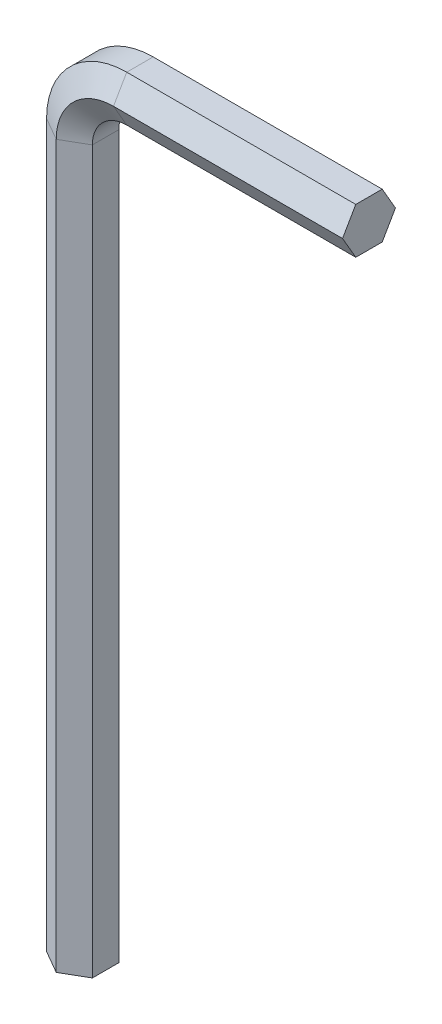
ISO-10303-21;
HEADER;
FILE_DESCRIPTION(('STEP AP214'),'2;1');
FILE_NAME('part.step','',(''),(''),'','','');
FILE_SCHEMA(('AUTOMOTIVE_DESIGN { 1 0 10303 214 1 1 1 1 }'));
ENDSEC;
DATA;
#1=APPLICATION_CONTEXT('core data for automotive mechanical design processes');
#2=APPLICATION_PROTOCOL_DEFINITION('international standard','automotive_design',2000,#1);
#3=PRODUCT_CONTEXT('',#1,'mechanical');
#4=PRODUCT('Part','Part','',(#3));
#5=PRODUCT_RELATED_PRODUCT_CATEGORY('part','',(#4));
#6=PRODUCT_DEFINITION_FORMATION('','',#4);
#7=PRODUCT_DEFINITION_CONTEXT('part definition',#1,'design');
#8=PRODUCT_DEFINITION('design','',#6,#7);
#9=PRODUCT_DEFINITION_SHAPE('','',#8);
#10=(LENGTH_UNIT() NAMED_UNIT(*) SI_UNIT(.MILLI.,.METRE.));
#11=(NAMED_UNIT(*) PLANE_ANGLE_UNIT() SI_UNIT($,.RADIAN.));
#12=(NAMED_UNIT(*) SI_UNIT($,.STERADIAN.) SOLID_ANGLE_UNIT());
#13=UNCERTAINTY_MEASURE_WITH_UNIT(LENGTH_MEASURE(1.E-05),#10,'distance_accuracy_value','');
#14=(GEOMETRIC_REPRESENTATION_CONTEXT(3) GLOBAL_UNCERTAINTY_ASSIGNED_CONTEXT((#13)) GLOBAL_UNIT_ASSIGNED_CONTEXT((#10,
#11,#12)) REPRESENTATION_CONTEXT('',''));
#15=CARTESIAN_POINT('',(0.,0.,0.));
#16=DIRECTION('',(0.,0.,1.));
#17=DIRECTION('',(1.,0.,0.));
#18=AXIS2_PLACEMENT_3D('',#15,#16,#17);
#19=CARTESIAN_POINT('',(0.,0.,0.));
#20=DIRECTION('',(0.,1.,0.));
#21=DIRECTION('',(0.,0.,1.));
#22=AXIS2_PLACEMENT_3D('',#19,#20,#21);
#23=PLANE('',#22);
#24=DIRECTION('',(0.866025403784439,0.,-0.5));
#25=VECTOR('',#24,1.);
#26=CARTESIAN_POINT('',(0.,0.,2.3094010767585));
#27=LINE('',#26,#25);
#28=CARTESIAN_POINT('',(0.,0.,2.3094010767585));
#29=VERTEX_POINT('',#28);
#30=CARTESIAN_POINT('',(2.,0.,1.15470053837925));
#31=VERTEX_POINT('',#30);
#32=EDGE_CURVE('E186',#29,#31,#27,.T.);
#33=ORIENTED_EDGE('',*,*,#32,.F.);
#34=DIRECTION('',(0.866025403784438,0.,0.5));
#35=VECTOR('',#34,1.);
#36=CARTESIAN_POINT('',(-2.,0.,1.15470053837925));
#37=LINE('',#36,#35);
#38=CARTESIAN_POINT('',(-2.,0.,1.15470053837925));
#39=VERTEX_POINT('',#38);
#40=EDGE_CURVE('E228',#39,#29,#37,.T.);
#41=ORIENTED_EDGE('',*,*,#40,.F.);
#42=DIRECTION('',(0.,0.,1.));
#43=VECTOR('',#42,1.);
#44=CARTESIAN_POINT('',(-2.,0.,-1.15470053837925));
#45=LINE('',#44,#43);
#46=CARTESIAN_POINT('',(-2.,0.,-1.15470053837925));
#47=VERTEX_POINT('',#46);
#48=EDGE_CURVE('E215',#47,#39,#45,.T.);
#49=ORIENTED_EDGE('',*,*,#48,.F.);
#50=DIRECTION('',(-0.866025403784439,0.,0.5));
#51=VECTOR('',#50,1.);
#52=CARTESIAN_POINT('',(0.,0.,-2.3094010767585));
#53=LINE('',#52,#51);
#54=CARTESIAN_POINT('',(0.,0.,-2.3094010767585));
#55=VERTEX_POINT('',#54);
#56=EDGE_CURVE('E138',#55,#47,#53,.T.);
#57=ORIENTED_EDGE('',*,*,#56,.F.);
#58=DIRECTION('',(-0.866025403784438,0.,-0.5));
#59=VECTOR('',#58,1.);
#60=CARTESIAN_POINT('',(2.,0.,-1.15470053837925));
#61=LINE('',#60,#59);
#62=CARTESIAN_POINT('',(2.,0.,-1.15470053837925));
#63=VERTEX_POINT('',#62);
#64=EDGE_CURVE('E142',#63,#55,#61,.T.);
#65=ORIENTED_EDGE('',*,*,#64,.F.);
#66=DIRECTION('',(0.,0.,-1.));
#67=VECTOR('',#66,1.);
#68=CARTESIAN_POINT('',(2.,0.,1.15470053837925));
#69=LINE('',#68,#67);
#70=EDGE_CURVE('E147',#31,#63,#69,.T.);
#71=ORIENTED_EDGE('',*,*,#70,.F.);
#72=EDGE_LOOP('',(#33,#41,#49,#57,#65,#71));
#73=FACE_BOUND('',#72,.T.);
#74=ADVANCED_FACE('F37',(#73),#23,.F.);
#75=CARTESIAN_POINT('',(25.,68.,0.));
#76=DIRECTION('',(1.,0.,0.));
#77=DIRECTION('',(0.,0.,1.));
#78=AXIS2_PLACEMENT_3D('',#75,#76,#77);
#79=PLANE('',#78);
#80=DIRECTION('',(0.,-0.866025403784439,-0.5));
#81=VECTOR('',#80,1.);
#82=CARTESIAN_POINT('',(25.,68.,2.3094010767585));
#83=LINE('',#82,#81);
#84=CARTESIAN_POINT('',(25.,68.,2.3094010767585));
#85=VERTEX_POINT('',#84);
#86=CARTESIAN_POINT('',(25.,66.,1.15470053837925));
#87=VERTEX_POINT('',#86);
#88=EDGE_CURVE('E158',#85,#87,#83,.T.);
#89=ORIENTED_EDGE('',*,*,#88,.T.);
#90=DIRECTION('',(0.,0.,-1.));
#91=VECTOR('',#90,1.);
#92=CARTESIAN_POINT('',(25.,66.,1.15470053837925));
#93=LINE('',#92,#91);
#94=CARTESIAN_POINT('',(25.,66.,-1.15470053837925));
#95=VERTEX_POINT('',#94);
#96=EDGE_CURVE('E161',#87,#95,#93,.T.);
#97=ORIENTED_EDGE('',*,*,#96,.T.);
#98=DIRECTION('',(0.,0.866025403784438,-0.5));
#99=VECTOR('',#98,1.);
#100=CARTESIAN_POINT('',(25.,66.,-1.15470053837925));
#101=LINE('',#100,#99);
#102=CARTESIAN_POINT('',(25.,68.,-2.3094010767585));
#103=VERTEX_POINT('',#102);
#104=EDGE_CURVE('E201',#95,#103,#101,.T.);
#105=ORIENTED_EDGE('',*,*,#104,.T.);
#106=DIRECTION('',(0.,0.866025403784439,0.5));
#107=VECTOR('',#106,1.);
#108=CARTESIAN_POINT('',(25.,68.,-2.3094010767585));
#109=LINE('',#108,#107);
#110=CARTESIAN_POINT('',(25.,70.,-1.15470053837925));
#111=VERTEX_POINT('',#110);
#112=EDGE_CURVE('E56',#103,#111,#109,.T.);
#113=ORIENTED_EDGE('',*,*,#112,.T.);
#114=DIRECTION('',(0.,0.,1.));
#115=VECTOR('',#114,1.);
#116=CARTESIAN_POINT('',(25.,70.,-1.15470053837925));
#117=LINE('',#116,#115);
#118=CARTESIAN_POINT('',(25.,70.,1.15470053837925));
#119=VERTEX_POINT('',#118);
#120=EDGE_CURVE('E50',#111,#119,#117,.T.);
#121=ORIENTED_EDGE('',*,*,#120,.T.);
#122=DIRECTION('',(0.,-0.866025403784438,0.5));
#123=VECTOR('',#122,1.);
#124=CARTESIAN_POINT('',(25.,70.,1.15470053837925));
#125=LINE('',#124,#123);
#126=EDGE_CURVE('E11',#119,#85,#125,.T.);
#127=ORIENTED_EDGE('',*,*,#126,.T.);
#128=EDGE_LOOP('',(#89,#97,#105,#113,#121,#127));
#129=FACE_BOUND('',#128,.T.);
#130=ADVANCED_FACE('F160',(#129),#79,.T.);
#131=CARTESIAN_POINT('',(0.,0.,2.3094010767585));
#132=DIRECTION('',(0.5,0.,0.866025403784439));
#133=DIRECTION('',(0.866025403784439,0.,-0.5));
#134=AXIS2_PLACEMENT_3D('',#131,#132,#133);
#135=PLANE('',#134);
#136=DIRECTION('',(0.,1.,0.));
#137=VECTOR('',#136,1.);
#138=CARTESIAN_POINT('',(2.,0.,1.15470053837925));
#139=LINE('',#138,#137);
#140=CARTESIAN_POINT('',(2.,63.,1.15470053837925));
#141=VERTEX_POINT('',#140);
#142=EDGE_CURVE('E191',#31,#141,#139,.T.);
#143=ORIENTED_EDGE('',*,*,#142,.T.);
#144=DIRECTION('',(0.866025403784439,0.,-0.5));
#145=VECTOR('',#144,1.);
#146=CARTESIAN_POINT('',(0.,63.,2.3094010767585));
#147=LINE('',#146,#145);
#148=CARTESIAN_POINT('',(0.,63.,2.3094010767585));
#149=VERTEX_POINT('',#148);
#150=EDGE_CURVE('E260',#149,#141,#147,.T.);
#151=ORIENTED_EDGE('',*,*,#150,.F.);
#152=DIRECTION('',(0.,1.,0.));
#153=VECTOR('',#152,1.);
#154=CARTESIAN_POINT('',(0.,0.,2.3094010767585));
#155=LINE('',#154,#153);
#156=EDGE_CURVE('E242',#29,#149,#155,.T.);
#157=ORIENTED_EDGE('',*,*,#156,.F.);
#158=ORIENTED_EDGE('',*,*,#32,.T.);
#159=EDGE_LOOP('',(#143,#151,#157,#158));
#160=FACE_BOUND('',#159,.T.);
#161=ADVANCED_FACE('F267',(#160),#135,.T.);
#162=CARTESIAN_POINT('',(2.,0.,1.15470053837925));
#163=DIRECTION('',(1.,0.,0.));
#164=DIRECTION('',(0.,0.,-1.));
#165=AXIS2_PLACEMENT_3D('',#162,#163,#164);
#166=PLANE('',#165);
#167=DIRECTION('',(0.,1.,0.));
#168=VECTOR('',#167,1.);
#169=CARTESIAN_POINT('',(2.,0.,-1.15470053837925));
#170=LINE('',#169,#168);
#171=CARTESIAN_POINT('',(2.,63.,-1.15470053837925));
#172=VERTEX_POINT('',#171);
#173=EDGE_CURVE('E190',#63,#172,#170,.T.);
#174=ORIENTED_EDGE('',*,*,#173,.T.);
#175=DIRECTION('',(0.,0.,-1.));
#176=VECTOR('',#175,1.);
#177=CARTESIAN_POINT('',(2.,63.,1.15470053837925));
#178=LINE('',#177,#176);
#179=EDGE_CURVE('E187',#141,#172,#178,.T.);
#180=ORIENTED_EDGE('',*,*,#179,.F.);
#181=ORIENTED_EDGE('',*,*,#142,.F.);
#182=ORIENTED_EDGE('',*,*,#70,.T.);
#183=EDGE_LOOP('',(#174,#180,#181,#182));
#184=FACE_BOUND('',#183,.T.);
#185=ADVANCED_FACE('F270',(#184),#166,.T.);
#186=CARTESIAN_POINT('',(2.,0.,-1.15470053837925));
#187=DIRECTION('',(0.5,0.,-0.866025403784439));
#188=DIRECTION('',(-0.866025403784438,0.,-0.5));
#189=AXIS2_PLACEMENT_3D('',#186,#187,#188);
#190=PLANE('',#189);
#191=DIRECTION('',(0.,1.,0.));
#192=VECTOR('',#191,1.);
#193=CARTESIAN_POINT('',(0.,0.,-2.3094010767585));
#194=LINE('',#193,#192);
#195=CARTESIAN_POINT('',(0.,63.,-2.3094010767585));
#196=VERTEX_POINT('',#195);
#197=EDGE_CURVE('E204',#55,#196,#194,.T.);
#198=ORIENTED_EDGE('',*,*,#197,.T.);
#199=DIRECTION('',(-0.866025403784438,0.,-0.5));
#200=VECTOR('',#199,1.);
#201=CARTESIAN_POINT('',(2.,63.,-1.15470053837925));
#202=LINE('',#201,#200);
#203=EDGE_CURVE('E194',#172,#196,#202,.T.);
#204=ORIENTED_EDGE('',*,*,#203,.F.);
#205=ORIENTED_EDGE('',*,*,#173,.F.);
#206=ORIENTED_EDGE('',*,*,#64,.T.);
#207=EDGE_LOOP('',(#198,#204,#205,#206));
#208=FACE_BOUND('',#207,.T.);
#209=ADVANCED_FACE('F324',(#208),#190,.T.);
#210=CARTESIAN_POINT('',(0.,0.,-2.3094010767585));
#211=DIRECTION('',(-0.5,0.,-0.866025403784439));
#212=DIRECTION('',(-0.866025403784439,0.,0.5));
#213=AXIS2_PLACEMENT_3D('',#210,#211,#212);
#214=PLANE('',#213);
#215=DIRECTION('',(0.,1.,0.));
#216=VECTOR('',#215,1.);
#217=CARTESIAN_POINT('',(-2.,0.,-1.15470053837925));
#218=LINE('',#217,#216);
#219=CARTESIAN_POINT('',(-2.,63.,-1.15470053837925));
#220=VERTEX_POINT('',#219);
#221=EDGE_CURVE('E217',#47,#220,#218,.T.);
#222=ORIENTED_EDGE('',*,*,#221,.T.);
#223=DIRECTION('',(-0.866025403784439,0.,0.5));
#224=VECTOR('',#223,1.);
#225=CARTESIAN_POINT('',(0.,63.,-2.3094010767585));
#226=LINE('',#225,#224);
#227=EDGE_CURVE('E207',#196,#220,#226,.T.);
#228=ORIENTED_EDGE('',*,*,#227,.F.);
#229=ORIENTED_EDGE('',*,*,#197,.F.);
#230=ORIENTED_EDGE('',*,*,#56,.T.);
#231=EDGE_LOOP('',(#222,#228,#229,#230));
#232=FACE_BOUND('',#231,.T.);
#233=ADVANCED_FACE('F332',(#232),#214,.T.);
#234=CARTESIAN_POINT('',(-2.,0.,-1.15470053837925));
#235=DIRECTION('',(-1.,0.,0.));
#236=DIRECTION('',(0.,0.,1.));
#237=AXIS2_PLACEMENT_3D('',#234,#235,#236);
#238=PLANE('',#237);
#239=DIRECTION('',(0.,1.,0.));
#240=VECTOR('',#239,1.);
#241=CARTESIAN_POINT('',(-2.,0.,1.15470053837925));
#242=LINE('',#241,#240);
#243=CARTESIAN_POINT('',(-2.,63.,1.15470053837925));
#244=VERTEX_POINT('',#243);
#245=EDGE_CURVE('E230',#39,#244,#242,.T.);
#246=ORIENTED_EDGE('',*,*,#245,.T.);
#247=DIRECTION('',(0.,0.,1.));
#248=VECTOR('',#247,1.);
#249=CARTESIAN_POINT('',(-2.,63.,-1.15470053837925));
#250=LINE('',#249,#248);
#251=EDGE_CURVE('E220',#220,#244,#250,.T.);
#252=ORIENTED_EDGE('',*,*,#251,.F.);
#253=ORIENTED_EDGE('',*,*,#221,.F.);
#254=ORIENTED_EDGE('',*,*,#48,.T.);
#255=EDGE_LOOP('',(#246,#252,#253,#254));
#256=FACE_BOUND('',#255,.T.);
#257=ADVANCED_FACE('F342',(#256),#238,.T.);
#258=CARTESIAN_POINT('',(-2.,0.,1.15470053837925));
#259=DIRECTION('',(-0.5,0.,0.866025403784439));
#260=DIRECTION('',(0.866025403784438,0.,0.5));
#261=AXIS2_PLACEMENT_3D('',#258,#259,#260);
#262=PLANE('',#261);
#263=DIRECTION('',(0.866025403784438,0.,0.5));
#264=VECTOR('',#263,1.);
#265=CARTESIAN_POINT('',(-2.,63.,1.15470053837925));
#266=LINE('',#265,#264);
#267=EDGE_CURVE('E233',#244,#149,#266,.T.);
#268=ORIENTED_EDGE('',*,*,#267,.F.);
#269=ORIENTED_EDGE('',*,*,#245,.F.);
#270=ORIENTED_EDGE('',*,*,#40,.T.);
#271=ORIENTED_EDGE('',*,*,#156,.T.);
#272=EDGE_LOOP('',(#268,#269,#270,#271));
#273=FACE_BOUND('',#272,.T.);
#274=ADVANCED_FACE('F283',(#273),#262,.T.);
#275=CARTESIAN_POINT('',(5.,63.,2.3094010767585));
#276=DIRECTION('',(0.,0.,1.));
#277=DIRECTION('',(1.,0.,0.));
#278=AXIS2_PLACEMENT_3D('',#275,#276,#277);
#279=CONICAL_SURFACE('',#278,5.,1.0471975511966);
#280=CARTESIAN_POINT('',(5.,63.,1.15470053837925));
#281=DIRECTION('',(0.,0.,-1.));
#282=DIRECTION('',(-1.,0.,0.));
#283=AXIS2_PLACEMENT_3D('',#280,#281,#282);
#284=CIRCLE('',#283,3.);
#285=CARTESIAN_POINT('',(5.00000000000002,66.,1.15470053837925));
#286=VERTEX_POINT('',#285);
#287=EDGE_CURVE('E197',#141,#286,#284,.T.);
#288=ORIENTED_EDGE('',*,*,#287,.T.);
#289=DIRECTION('',(0.,-0.866025403784439,-0.5));
#290=VECTOR('',#289,1.);
#291=CARTESIAN_POINT('',(5.00000000000003,68.,2.3094010767585));
#292=LINE('',#291,#290);
#293=CARTESIAN_POINT('',(5.00000000000003,68.,2.3094010767585));
#294=VERTEX_POINT('',#293);
#295=EDGE_CURVE('E179',#294,#286,#292,.T.);
#296=ORIENTED_EDGE('',*,*,#295,.F.);
#297=CARTESIAN_POINT('',(5.,63.,2.3094010767585));
#298=DIRECTION('',(0.,0.,-1.));
#299=DIRECTION('',(-1.,0.,0.));
#300=AXIS2_PLACEMENT_3D('',#297,#298,#299);
#301=CIRCLE('',#300,5.);
#302=EDGE_CURVE('E244',#149,#294,#301,.T.);
#303=ORIENTED_EDGE('',*,*,#302,.F.);
#304=ORIENTED_EDGE('',*,*,#150,.T.);
#305=EDGE_LOOP('',(#288,#296,#303,#304));
#306=FACE_BOUND('',#305,.T.);
#307=ADVANCED_FACE('F250',(#306),#279,.F.);
#308=CARTESIAN_POINT('',(5.,63.,0.));
#309=DIRECTION('',(0.,0.,-1.));
#310=DIRECTION('',(-1.,0.,0.));
#311=AXIS2_PLACEMENT_3D('',#308,#309,#310);
#312=CYLINDRICAL_SURFACE('',#311,3.);
#313=CARTESIAN_POINT('',(5.,63.,-1.15470053837925));
#314=DIRECTION('',(0.,0.,-1.));
#315=DIRECTION('',(-1.,0.,0.));
#316=AXIS2_PLACEMENT_3D('',#313,#314,#315);
#317=CIRCLE('',#316,3.);
#318=CARTESIAN_POINT('',(5.00000000000002,66.,-1.15470053837925));
#319=VERTEX_POINT('',#318);
#320=EDGE_CURVE('E125',#172,#319,#317,.T.);
#321=ORIENTED_EDGE('',*,*,#320,.T.);
#322=DIRECTION('',(0.,0.,-1.));
#323=VECTOR('',#322,1.);
#324=CARTESIAN_POINT('',(5.00000000000002,66.,1.15470053837925));
#325=LINE('',#324,#323);
#326=EDGE_CURVE('E195',#286,#319,#325,.T.);
#327=ORIENTED_EDGE('',*,*,#326,.F.);
#328=ORIENTED_EDGE('',*,*,#287,.F.);
#329=ORIENTED_EDGE('',*,*,#179,.T.);
#330=EDGE_LOOP('',(#321,#327,#328,#329));
#331=FACE_BOUND('',#330,.T.);
#332=ADVANCED_FACE('F273',(#331),#312,.F.);
#333=CARTESIAN_POINT('',(5.,63.,-1.15470053837925));
#334=DIRECTION('',(0.,0.,-1.));
#335=DIRECTION('',(-1.,0.,0.));
#336=AXIS2_PLACEMENT_3D('',#333,#334,#335);
#337=CONICAL_SURFACE('',#336,3.,1.0471975511966);
#338=CARTESIAN_POINT('',(5.,63.,-2.3094010767585));
#339=DIRECTION('',(0.,0.,-1.));
#340=DIRECTION('',(-1.,0.,0.));
#341=AXIS2_PLACEMENT_3D('',#338,#339,#340);
#342=CIRCLE('',#341,5.);
#343=CARTESIAN_POINT('',(5.00000000000003,68.,-2.3094010767585));
#344=VERTEX_POINT('',#343);
#345=EDGE_CURVE('E116',#196,#344,#342,.T.);
#346=ORIENTED_EDGE('',*,*,#345,.T.);
#347=DIRECTION('',(0.,0.866025403784438,-0.5));
#348=VECTOR('',#347,1.);
#349=CARTESIAN_POINT('',(5.00000000000002,66.,-1.15470053837925));
#350=LINE('',#349,#348);
#351=EDGE_CURVE('E198',#319,#344,#350,.T.);
#352=ORIENTED_EDGE('',*,*,#351,.F.);
#353=ORIENTED_EDGE('',*,*,#320,.F.);
#354=ORIENTED_EDGE('',*,*,#203,.T.);
#355=EDGE_LOOP('',(#346,#352,#353,#354));
#356=FACE_BOUND('',#355,.T.);
#357=ADVANCED_FACE('F275',(#356),#337,.F.);
#358=CARTESIAN_POINT('',(5.,63.,-2.3094010767585));
#359=DIRECTION('',(0.,0.,1.));
#360=DIRECTION('',(1.,0.,0.));
#361=AXIS2_PLACEMENT_3D('',#358,#359,#360);
#362=CONICAL_SURFACE('',#361,5.,1.0471975511966);
#363=CARTESIAN_POINT('',(5.,63.,-1.15470053837925));
#364=DIRECTION('',(0.,0.,-1.));
#365=DIRECTION('',(-1.,0.,0.));
#366=AXIS2_PLACEMENT_3D('',#363,#364,#365);
#367=CIRCLE('',#366,7.);
#368=CARTESIAN_POINT('',(5.00000000000005,70.,-1.15470053837925));
#369=VERTEX_POINT('',#368);
#370=EDGE_CURVE('E109',#220,#369,#367,.T.);
#371=ORIENTED_EDGE('',*,*,#370,.T.);
#372=DIRECTION('',(0.,0.866025403784439,0.5));
#373=VECTOR('',#372,1.);
#374=CARTESIAN_POINT('',(5.00000000000003,68.,-2.3094010767585));
#375=LINE('',#374,#373);
#376=EDGE_CURVE('E211',#344,#369,#375,.T.);
#377=ORIENTED_EDGE('',*,*,#376,.F.);
#378=ORIENTED_EDGE('',*,*,#345,.F.);
#379=ORIENTED_EDGE('',*,*,#227,.T.);
#380=EDGE_LOOP('',(#371,#377,#378,#379));
#381=FACE_BOUND('',#380,.T.);
#382=ADVANCED_FACE('F281',(#381),#362,.T.);
#383=CARTESIAN_POINT('',(5.,63.,0.));
#384=DIRECTION('',(0.,0.,-1.));
#385=DIRECTION('',(-1.,0.,0.));
#386=AXIS2_PLACEMENT_3D('',#383,#384,#385);
#387=CYLINDRICAL_SURFACE('',#386,7.);
#388=CARTESIAN_POINT('',(5.,63.,1.15470053837925));
#389=DIRECTION('',(0.,0.,-1.));
#390=DIRECTION('',(-1.,0.,0.));
#391=AXIS2_PLACEMENT_3D('',#388,#389,#390);
#392=CIRCLE('',#391,7.);
#393=CARTESIAN_POINT('',(5.00000000000005,70.,1.15470053837925));
#394=VERTEX_POINT('',#393);
#395=EDGE_CURVE('E235',#244,#394,#392,.T.);
#396=ORIENTED_EDGE('',*,*,#395,.T.);
#397=DIRECTION('',(0.,0.,1.));
#398=VECTOR('',#397,1.);
#399=CARTESIAN_POINT('',(5.00000000000005,70.,-1.15470053837925));
#400=LINE('',#399,#398);
#401=EDGE_CURVE('E223',#369,#394,#400,.T.);
#402=ORIENTED_EDGE('',*,*,#401,.F.);
#403=ORIENTED_EDGE('',*,*,#370,.F.);
#404=ORIENTED_EDGE('',*,*,#251,.T.);
#405=EDGE_LOOP('',(#396,#402,#403,#404));
#406=FACE_BOUND('',#405,.T.);
#407=ADVANCED_FACE('F385',(#406),#387,.T.);
#408=CARTESIAN_POINT('',(5.,63.,1.15470053837925));
#409=DIRECTION('',(0.,0.,-1.));
#410=DIRECTION('',(-1.,0.,0.));
#411=AXIS2_PLACEMENT_3D('',#408,#409,#410);
#412=CONICAL_SURFACE('',#411,7.,1.0471975511966);
#413=DIRECTION('',(0.,-0.866025403784438,0.5));
#414=VECTOR('',#413,1.);
#415=CARTESIAN_POINT('',(5.00000000000005,70.,1.15470053837925));
#416=LINE('',#415,#414);
#417=EDGE_CURVE('E184',#394,#294,#416,.T.);
#418=ORIENTED_EDGE('',*,*,#417,.F.);
#419=ORIENTED_EDGE('',*,*,#395,.F.);
#420=ORIENTED_EDGE('',*,*,#267,.T.);
#421=ORIENTED_EDGE('',*,*,#302,.T.);
#422=EDGE_LOOP('',(#418,#419,#420,#421));
#423=FACE_BOUND('',#422,.T.);
#424=ADVANCED_FACE('F253',(#423),#412,.T.);
#425=CARTESIAN_POINT('',(5.00000000000003,68.,2.3094010767585));
#426=DIRECTION('',(0.,-0.5,0.866025403784439));
#427=DIRECTION('',(0.,-0.866025403784439,-0.5));
#428=AXIS2_PLACEMENT_3D('',#425,#426,#427);
#429=PLANE('',#428);
#430=DIRECTION('',(1.,0.,0.));
#431=VECTOR('',#430,1.);
#432=CARTESIAN_POINT('',(5.00000000000003,66.,1.15470053837925));
#433=LINE('',#432,#431);
#434=EDGE_CURVE('E166',#286,#87,#433,.T.);
#435=ORIENTED_EDGE('',*,*,#434,.T.);
#436=ORIENTED_EDGE('',*,*,#88,.F.);
#437=DIRECTION('',(1.,0.,0.));
#438=VECTOR('',#437,1.);
#439=CARTESIAN_POINT('',(5.00000000000003,68.,2.3094010767585));
#440=LINE('',#439,#438);
#441=EDGE_CURVE('E167',#294,#85,#440,.T.);
#442=ORIENTED_EDGE('',*,*,#441,.F.);
#443=ORIENTED_EDGE('',*,*,#295,.T.);
#444=EDGE_LOOP('',(#435,#436,#442,#443));
#445=FACE_BOUND('',#444,.T.);
#446=ADVANCED_FACE('F177',(#445),#429,.T.);
#447=CARTESIAN_POINT('',(5.00000000000003,66.,1.15470053837925));
#448=DIRECTION('',(0.,-1.,0.));
#449=DIRECTION('',(0.,0.,-1.));
#450=AXIS2_PLACEMENT_3D('',#447,#448,#449);
#451=PLANE('',#450);
#452=DIRECTION('',(1.,0.,0.));
#453=VECTOR('',#452,1.);
#454=CARTESIAN_POINT('',(5.00000000000003,66.,-1.15470053837925));
#455=LINE('',#454,#453);
#456=EDGE_CURVE('E174',#319,#95,#455,.T.);
#457=ORIENTED_EDGE('',*,*,#456,.T.);
#458=ORIENTED_EDGE('',*,*,#96,.F.);
#459=ORIENTED_EDGE('',*,*,#434,.F.);
#460=ORIENTED_EDGE('',*,*,#326,.T.);
#461=EDGE_LOOP('',(#457,#458,#459,#460));
#462=FACE_BOUND('',#461,.T.);
#463=ADVANCED_FACE('F171',(#462),#451,.T.);
#464=CARTESIAN_POINT('',(5.00000000000003,66.,-1.15470053837925));
#465=DIRECTION('',(0.,-0.5,-0.866025403784439));
#466=DIRECTION('',(0.,0.866025403784439,-0.5));
#467=AXIS2_PLACEMENT_3D('',#464,#465,#466);
#468=PLANE('',#467);
#469=DIRECTION('',(1.,0.,0.));
#470=VECTOR('',#469,1.);
#471=CARTESIAN_POINT('',(5.00000000000003,68.,-2.3094010767585));
#472=LINE('',#471,#470);
#473=EDGE_CURVE('E94',#344,#103,#472,.T.);
#474=ORIENTED_EDGE('',*,*,#473,.T.);
#475=ORIENTED_EDGE('',*,*,#104,.F.);
#476=ORIENTED_EDGE('',*,*,#456,.F.);
#477=ORIENTED_EDGE('',*,*,#351,.T.);
#478=EDGE_LOOP('',(#474,#475,#476,#477));
#479=FACE_BOUND('',#478,.T.);
#480=ADVANCED_FACE('F417',(#479),#468,.T.);
#481=CARTESIAN_POINT('',(5.00000000000003,68.,-2.3094010767585));
#482=DIRECTION('',(0.,0.5,-0.866025403784439));
#483=DIRECTION('',(0.,0.866025403784439,0.5));
#484=AXIS2_PLACEMENT_3D('',#481,#482,#483);
#485=PLANE('',#484);
#486=DIRECTION('',(1.,0.,0.));
#487=VECTOR('',#486,1.);
#488=CARTESIAN_POINT('',(5.00000000000003,70.,-1.15470053837925));
#489=LINE('',#488,#487);
#490=EDGE_CURVE('E86',#369,#111,#489,.T.);
#491=ORIENTED_EDGE('',*,*,#490,.T.);
#492=ORIENTED_EDGE('',*,*,#112,.F.);
#493=ORIENTED_EDGE('',*,*,#473,.F.);
#494=ORIENTED_EDGE('',*,*,#376,.T.);
#495=EDGE_LOOP('',(#491,#492,#493,#494));
#496=FACE_BOUND('',#495,.T.);
#497=ADVANCED_FACE('F293',(#496),#485,.T.);
#498=CARTESIAN_POINT('',(5.00000000000003,70.,-1.15470053837925));
#499=DIRECTION('',(0.,1.,0.));
#500=DIRECTION('',(0.,0.,1.));
#501=AXIS2_PLACEMENT_3D('',#498,#499,#500);
#502=PLANE('',#501);
#503=DIRECTION('',(1.,0.,0.));
#504=VECTOR('',#503,1.);
#505=CARTESIAN_POINT('',(5.00000000000003,70.,1.15470053837925));
#506=LINE('',#505,#504);
#507=EDGE_CURVE('E44',#394,#119,#506,.T.);
#508=ORIENTED_EDGE('',*,*,#507,.T.);
#509=ORIENTED_EDGE('',*,*,#120,.F.);
#510=ORIENTED_EDGE('',*,*,#490,.F.);
#511=ORIENTED_EDGE('',*,*,#401,.T.);
#512=EDGE_LOOP('',(#508,#509,#510,#511));
#513=FACE_BOUND('',#512,.T.);
#514=ADVANCED_FACE('F288',(#513),#502,.T.);
#515=CARTESIAN_POINT('',(5.00000000000003,70.,1.15470053837925));
#516=DIRECTION('',(0.,0.5,0.866025403784439));
#517=DIRECTION('',(0.,-0.866025403784439,0.5));
#518=AXIS2_PLACEMENT_3D('',#515,#516,#517);
#519=PLANE('',#518);
#520=ORIENTED_EDGE('',*,*,#126,.F.);
#521=ORIENTED_EDGE('',*,*,#507,.F.);
#522=ORIENTED_EDGE('',*,*,#417,.T.);
#523=ORIENTED_EDGE('',*,*,#441,.T.);
#524=EDGE_LOOP('',(#520,#521,#522,#523));
#525=FACE_BOUND('',#524,.T.);
#526=ADVANCED_FACE('F245',(#525),#519,.T.);
#527=CLOSED_SHELL('',(#74,#130,#161,#185,#209,#233,#257,#274,#307,#332,#357,#382,#407,#424,#446,
#463,#480,#497,#514,#526));
#528=MANIFOLD_SOLID_BREP('B2',#527);
#529=ADVANCED_BREP_SHAPE_REPRESENTATION('',(#18,#528),#14);
#530=SHAPE_DEFINITION_REPRESENTATION(#9,#529);
ENDSEC;
END-ISO-10303-21;
